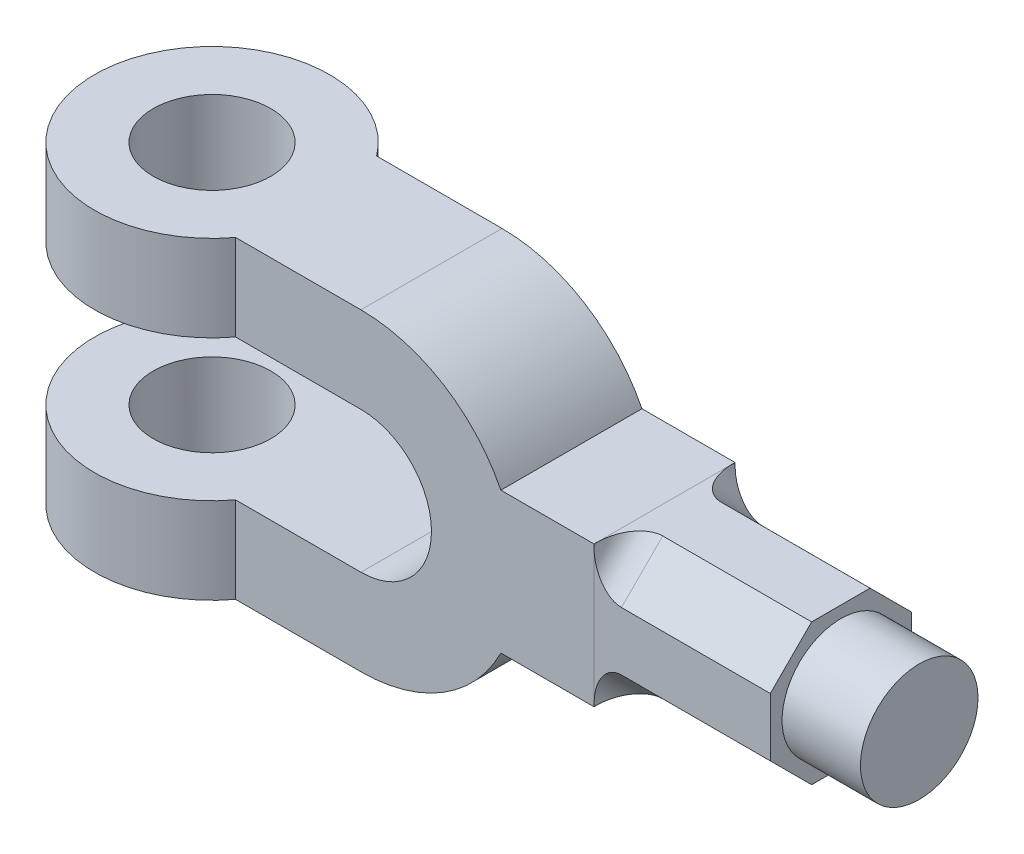
ISO-10303-21;
HEADER;
FILE_DESCRIPTION(('STEP AP214'),'2;1');
FILE_NAME('part.step','',(''),(''),'','','');
FILE_SCHEMA(('AUTOMOTIVE_DESIGN { 1 0 10303 214 1 1 1 1 }'));
ENDSEC;
DATA;
#1=APPLICATION_CONTEXT('core data for automotive mechanical design processes');
#2=APPLICATION_PROTOCOL_DEFINITION('international standard','automotive_design',2000,#1);
#3=PRODUCT_CONTEXT('',#1,'mechanical');
#4=PRODUCT('Part','Part','',(#3));
#5=PRODUCT_RELATED_PRODUCT_CATEGORY('part','',(#4));
#6=PRODUCT_DEFINITION_FORMATION('','',#4);
#7=PRODUCT_DEFINITION_CONTEXT('part definition',#1,'design');
#8=PRODUCT_DEFINITION('design','',#6,#7);
#9=PRODUCT_DEFINITION_SHAPE('','',#8);
#10=(LENGTH_UNIT() NAMED_UNIT(*) SI_UNIT(.MILLI.,.METRE.));
#11=(NAMED_UNIT(*) PLANE_ANGLE_UNIT() SI_UNIT($,.RADIAN.));
#12=(NAMED_UNIT(*) SI_UNIT($,.STERADIAN.) SOLID_ANGLE_UNIT());
#13=UNCERTAINTY_MEASURE_WITH_UNIT(LENGTH_MEASURE(1.E-05),#10,'distance_accuracy_value','');
#14=(GEOMETRIC_REPRESENTATION_CONTEXT(3) GLOBAL_UNCERTAINTY_ASSIGNED_CONTEXT((#13)) GLOBAL_UNIT_ASSIGNED_CONTEXT((#10,
#11,#12)) REPRESENTATION_CONTEXT('',''));
#15=CARTESIAN_POINT('',(0.,0.,0.));
#16=DIRECTION('',(0.,0.,1.));
#17=DIRECTION('',(1.,0.,0.));
#18=AXIS2_PLACEMENT_3D('',#15,#16,#17);
#19=CARTESIAN_POINT('',(115.485048466517,0.,18.));
#20=DIRECTION('',(1.,0.,0.));
#21=DIRECTION('',(0.,0.,-1.));
#22=AXIS2_PLACEMENT_3D('',#19,#20,#21);
#23=PLANE('',#22);
#24=CARTESIAN_POINT('',(115.485048466517,-18.,18.));
#25=DIRECTION('',(0.,0.,-1.));
#26=VECTOR('',#25,1.);
#27=LINE('',#24,#26);
#28=CARTESIAN_POINT('',(115.485048466517,-18.,18.));
#29=VERTEX_POINT('',#28);
#30=CARTESIAN_POINT('',(115.485048466517,-18.,17.3551023928193));
#31=VERTEX_POINT('',#30);
#32=EDGE_CURVE('E60',#29,#31,#27,.T.);
#33=ORIENTED_EDGE('',*,*,#32,.T.);
#34=DIRECTION('',(0.,-0.706844572080056,-0.707368893096779));
#35=VECTOR('',#34,1.);
#36=CARTESIAN_POINT('',(115.485048466517,-8.68422480163223,26.6777878185787));
#37=LINE('',#36,#35);
#38=CARTESIAN_POINT('',(115.485048466517,-17.3555804084239,18.));
#39=VERTEX_POINT('',#38);
#40=EDGE_CURVE('E662',#31,#39,#37,.F.);
#41=ORIENTED_EDGE('',*,*,#40,.T.);
#42=CARTESIAN_POINT('',(115.485048466517,-17.3555804084239,18.));
#43=DIRECTION('',(0.,-1.,0.));
#44=VECTOR('',#43,1.);
#45=LINE('',#42,#44);
#46=EDGE_CURVE('E640',#39,#29,#45,.T.);
#47=ORIENTED_EDGE('',*,*,#46,.T.);
#48=EDGE_LOOP('',(#33,#41,#47));
#49=FACE_BOUND('',#48,.T.);
#50=ADVANCED_FACE('F41',(#49),#23,.T.);
#51=CARTESIAN_POINT('',(115.485048466517,18.,18.));
#52=DIRECTION('',(0.,-1.,0.));
#53=VECTOR('',#52,1.);
#54=LINE('',#51,#53);
#55=CARTESIAN_POINT('',(115.485048466517,18.,18.));
#56=VERTEX_POINT('',#55);
#57=CARTESIAN_POINT('',(115.485048466517,17.3551023928194,18.));
#58=VERTEX_POINT('',#57);
#59=EDGE_CURVE('E320',#56,#58,#54,.T.);
#60=ORIENTED_EDGE('',*,*,#59,.T.);
#61=DIRECTION('',(0.,-0.707368893096779,0.706844572080056));
#62=VECTOR('',#61,1.);
#63=CARTESIAN_POINT('',(115.485048466517,8.67111677621415,26.6775488108421));
#64=LINE('',#63,#62);
#65=CARTESIAN_POINT('',(115.485048466517,18.,17.3555804084239));
#66=VERTEX_POINT('',#65);
#67=EDGE_CURVE('E989',#58,#66,#64,.F.);
#68=ORIENTED_EDGE('',*,*,#67,.T.);
#69=CARTESIAN_POINT('',(115.485048466517,18.,18.));
#70=DIRECTION('',(0.,0.,-1.));
#71=VECTOR('',#70,1.);
#72=LINE('',#69,#71);
#73=EDGE_CURVE('E1085',#56,#66,#72,.T.);
#74=ORIENTED_EDGE('',*,*,#73,.F.);
#75=EDGE_LOOP('',(#60,#68,#74));
#76=FACE_BOUND('',#75,.T.);
#77=ADVANCED_FACE('F795',(#76),#23,.T.);
#78=CARTESIAN_POINT('',(115.485048466517,18.,-17.3551023928194));
#79=DIRECTION('',(0.,0.,-1.));
#80=VECTOR('',#79,1.);
#81=LINE('',#78,#80);
#82=CARTESIAN_POINT('',(115.485048466517,18.,-17.3551023928194));
#83=VERTEX_POINT('',#82);
#84=CARTESIAN_POINT('',(115.485048466517,18.,-18.));
#85=VERTEX_POINT('',#84);
#86=EDGE_CURVE('E312',#83,#85,#81,.T.);
#87=ORIENTED_EDGE('',*,*,#86,.F.);
#88=DIRECTION('',(0.,0.706844572080056,0.707368893096779));
#89=VECTOR('',#88,1.);
#90=CARTESIAN_POINT('',(115.485048466517,26.6842198532067,-8.6644407854241));
#91=LINE('',#90,#89);
#92=CARTESIAN_POINT('',(115.485048466517,17.355580408424,-18.));
#93=VERTEX_POINT('',#92);
#94=EDGE_CURVE('E628',#83,#93,#91,.F.);
#95=ORIENTED_EDGE('',*,*,#94,.T.);
#96=CARTESIAN_POINT('',(115.485048466517,18.,-18.));
#97=DIRECTION('',(0.,-1.,0.));
#98=VECTOR('',#97,1.);
#99=LINE('',#96,#98);
#100=EDGE_CURVE('E360',#85,#93,#99,.T.);
#101=ORIENTED_EDGE('',*,*,#100,.F.);
#102=EDGE_LOOP('',(#87,#95,#101));
#103=FACE_BOUND('',#102,.T.);
#104=ADVANCED_FACE('F380',(#103),#23,.T.);
#105=CARTESIAN_POINT('',(0.,40.,-18.));
#106=DIRECTION('',(0.,0.,-1.));
#107=DIRECTION('',(-1.,0.,0.));
#108=AXIS2_PLACEMENT_3D('',#105,#106,#107);
#109=PLANE('',#108);
#110=DIRECTION('',(1.,0.,0.));
#111=VECTOR('',#110,1.);
#112=CARTESIAN_POINT('',(0.,18.,-18.));
#113=LINE('',#112,#111);
#114=CARTESIAN_POINT('',(24.,18.,-18.));
#115=VERTEX_POINT('',#114);
#116=CARTESIAN_POINT('',(56.,18.,-18.));
#117=VERTEX_POINT('',#116);
#118=EDGE_CURVE('E342',#115,#117,#113,.T.);
#119=ORIENTED_EDGE('',*,*,#118,.F.);
#120=DIRECTION('',(0.,-1.,0.));
#121=VECTOR('',#120,1.);
#122=CARTESIAN_POINT('',(24.,40.,-18.));
#123=LINE('',#122,#121);
#124=CARTESIAN_POINT('',(24.,40.,-18.));
#125=VERTEX_POINT('',#124);
#126=EDGE_CURVE('E336',#125,#115,#123,.T.);
#127=ORIENTED_EDGE('',*,*,#126,.F.);
#128=DIRECTION('',(1.,0.,0.));
#129=VECTOR('',#128,1.);
#130=CARTESIAN_POINT('',(0.,40.,-18.));
#131=LINE('',#130,#129);
#132=CARTESIAN_POINT('',(56.,40.,-18.));
#133=VERTEX_POINT('',#132);
#134=EDGE_CURVE('E333',#125,#133,#131,.T.);
#135=ORIENTED_EDGE('',*,*,#134,.T.);
#136=CARTESIAN_POINT('',(56.,0.,-18.));
#137=DIRECTION('',(0.,0.,-1.));
#138=DIRECTION('',(-1.,0.,0.));
#139=AXIS2_PLACEMENT_3D('',#136,#137,#138);
#140=CIRCLE('',#139,40.);
#141=CARTESIAN_POINT('',(91.7211421989835,18.,-18.));
#142=VERTEX_POINT('',#141);
#143=EDGE_CURVE('E306',#133,#142,#140,.T.);
#144=ORIENTED_EDGE('',*,*,#143,.T.);
#145=DIRECTION('',(-1.,0.,0.));
#146=VECTOR('',#145,1.);
#147=CARTESIAN_POINT('',(0.,18.,-18.));
#148=LINE('',#147,#146);
#149=EDGE_CURVE('E309',#85,#142,#148,.T.);
#150=ORIENTED_EDGE('',*,*,#149,.F.);
#151=ORIENTED_EDGE('',*,*,#100,.T.);
#152=CARTESIAN_POINT('',(115.485048466517,7.46151646033871,-17.9972348726268));
#153=DIRECTION('',(0.,0.999999931271866,0.000370750946443584));
#154=VECTOR('',#153,1.);
#155=LINE('',#152,#154);
#156=CARTESIAN_POINT('',(115.485048466517,7.46151748551237,-17.9992352682772));
#157=VERTEX_POINT('',#156);
#158=EDGE_CURVE('E451',#157,#93,#155,.T.);
#159=ORIENTED_EDGE('',*,*,#158,.F.);
#160=CARTESIAN_POINT('',(115.485048466517,-7.44917009325347,-18.0027630241587));
#161=DIRECTION('',(0.,0.999999931271866,0.000370750946443828));
#162=VECTOR('',#161,1.);
#163=LINE('',#160,#162);
#164=CARTESIAN_POINT('',(115.485048466517,-7.45017068973081,-18.0007633145425));
#165=VERTEX_POINT('',#164);
#166=EDGE_CURVE('E1016',#165,#157,#163,.T.);
#167=ORIENTED_EDGE('',*,*,#166,.F.);
#168=CARTESIAN_POINT('',(115.485048466517,-7.45017068973081,-18.));
#169=DIRECTION('',(0.,-1.,0.));
#170=VECTOR('',#169,1.);
#171=LINE('',#168,#170);
#172=CARTESIAN_POINT('',(115.485048466517,-17.3551023928194,-18.));
#173=VERTEX_POINT('',#172);
#174=EDGE_CURVE('E407',#165,#173,#171,.T.);
#175=ORIENTED_EDGE('',*,*,#174,.T.);
#176=CARTESIAN_POINT('',(115.485048466517,-17.3551023928194,-18.));
#177=DIRECTION('',(0.,-1.,0.));
#178=VECTOR('',#177,1.);
#179=LINE('',#176,#178);
#180=CARTESIAN_POINT('',(115.485048466517,-18.,-18.));
#181=VERTEX_POINT('',#180);
#182=EDGE_CURVE('E1043',#173,#181,#179,.T.);
#183=ORIENTED_EDGE('',*,*,#182,.T.);
#184=DIRECTION('',(-1.,0.,0.));
#185=VECTOR('',#184,1.);
#186=CARTESIAN_POINT('',(0.,-18.,-18.));
#187=LINE('',#186,#185);
#188=CARTESIAN_POINT('',(91.7211421989835,-18.,-18.));
#189=VERTEX_POINT('',#188);
#190=EDGE_CURVE('E288',#181,#189,#187,.T.);
#191=ORIENTED_EDGE('',*,*,#190,.T.);
#192=CARTESIAN_POINT('',(56.,0.,-18.));
#193=DIRECTION('',(0.,0.,-1.));
#194=DIRECTION('',(-1.,0.,0.));
#195=AXIS2_PLACEMENT_3D('',#192,#193,#194);
#196=CIRCLE('',#195,40.);
#197=CARTESIAN_POINT('',(56.,-40.,-18.));
#198=VERTEX_POINT('',#197);
#199=EDGE_CURVE('E300',#189,#198,#196,.T.);
#200=ORIENTED_EDGE('',*,*,#199,.T.);
#201=DIRECTION('',(1.,0.,0.));
#202=VECTOR('',#201,1.);
#203=CARTESIAN_POINT('',(0.,-40.,-18.));
#204=LINE('',#203,#202);
#205=CARTESIAN_POINT('',(24.,-40.,-18.));
#206=VERTEX_POINT('',#205);
#207=EDGE_CURVE('E276',#206,#198,#204,.T.);
#208=ORIENTED_EDGE('',*,*,#207,.F.);
#209=DIRECTION('',(0.,-1.,0.));
#210=VECTOR('',#209,1.);
#211=CARTESIAN_POINT('',(24.,40.,-18.));
#212=LINE('',#211,#210);
#213=CARTESIAN_POINT('',(24.,-18.,-18.));
#214=VERTEX_POINT('',#213);
#215=EDGE_CURVE('E286',#214,#206,#212,.T.);
#216=ORIENTED_EDGE('',*,*,#215,.F.);
#217=DIRECTION('',(-1.,0.,0.));
#218=VECTOR('',#217,1.);
#219=CARTESIAN_POINT('',(0.,-18.,-18.));
#220=LINE('',#219,#218);
#221=CARTESIAN_POINT('',(56.,-18.,-18.));
#222=VERTEX_POINT('',#221);
#223=EDGE_CURVE('E268',#222,#214,#220,.T.);
#224=ORIENTED_EDGE('',*,*,#223,.F.);
#225=CARTESIAN_POINT('',(56.,0.,-18.));
#226=DIRECTION('',(0.,0.,-1.));
#227=DIRECTION('',(-1.,0.,0.));
#228=AXIS2_PLACEMENT_3D('',#225,#226,#227);
#229=CIRCLE('',#228,18.);
#230=EDGE_CURVE('E303',#117,#222,#229,.T.);
#231=ORIENTED_EDGE('',*,*,#230,.F.);
#232=EDGE_LOOP('',(#119,#127,#135,#144,#150,#151,#159,#167,#175,#183,#191,#200,#208,#216,#224,#231));
#233=FACE_BOUND('',#232,.T.);
#234=ADVANCED_FACE('F369',(#233),#109,.T.);
#235=CARTESIAN_POINT('',(0.,40.,0.));
#236=DIRECTION('',(0.,-1.,0.));
#237=DIRECTION('',(0.,0.,-1.));
#238=AXIS2_PLACEMENT_3D('',#235,#236,#237);
#239=CYLINDRICAL_SURFACE('',#238,30.);
#240=ORIENTED_EDGE('',*,*,#126,.T.);
#241=CARTESIAN_POINT('',(0.,18.,0.));
#242=DIRECTION('',(0.,1.,0.));
#243=DIRECTION('',(0.,0.,1.));
#244=AXIS2_PLACEMENT_3D('',#241,#242,#243);
#245=CIRCLE('',#244,30.);
#246=CARTESIAN_POINT('',(24.,18.,18.));
#247=VERTEX_POINT('',#246);
#248=EDGE_CURVE('E345',#115,#247,#245,.T.);
#249=ORIENTED_EDGE('',*,*,#248,.T.);
#250=DIRECTION('',(0.,-1.,0.));
#251=VECTOR('',#250,1.);
#252=CARTESIAN_POINT('',(24.,40.,18.));
#253=LINE('',#252,#251);
#254=CARTESIAN_POINT('',(24.,40.,18.));
#255=VERTEX_POINT('',#254);
#256=EDGE_CURVE('E348',#255,#247,#253,.T.);
#257=ORIENTED_EDGE('',*,*,#256,.F.);
#258=CARTESIAN_POINT('',(0.,40.,0.));
#259=DIRECTION('',(0.,1.,0.));
#260=DIRECTION('',(0.,0.,1.));
#261=AXIS2_PLACEMENT_3D('',#258,#259,#260);
#262=CIRCLE('',#261,30.);
#263=EDGE_CURVE('E324',#125,#255,#262,.T.);
#264=ORIENTED_EDGE('',*,*,#263,.F.);
#265=EDGE_LOOP('',(#240,#249,#257,#264));
#266=FACE_BOUND('',#265,.T.);
#267=ADVANCED_FACE('F379',(#266),#239,.T.);
#268=CARTESIAN_POINT('',(0.,40.,18.));
#269=DIRECTION('',(0.,0.,-1.));
#270=DIRECTION('',(-1.,0.,0.));
#271=AXIS2_PLACEMENT_3D('',#268,#269,#270);
#272=PLANE('',#271);
#273=ORIENTED_EDGE('',*,*,#256,.T.);
#274=DIRECTION('',(1.,0.,0.));
#275=VECTOR('',#274,1.);
#276=CARTESIAN_POINT('',(0.,18.,18.));
#277=LINE('',#276,#275);
#278=CARTESIAN_POINT('',(56.,18.,18.));
#279=VERTEX_POINT('',#278);
#280=EDGE_CURVE('E339',#247,#279,#277,.T.);
#281=ORIENTED_EDGE('',*,*,#280,.T.);
#282=CARTESIAN_POINT('',(56.,0.,18.));
#283=DIRECTION('',(0.,0.,-1.));
#284=DIRECTION('',(-1.,0.,0.));
#285=AXIS2_PLACEMENT_3D('',#282,#283,#284);
#286=CIRCLE('',#285,18.);
#287=CARTESIAN_POINT('',(56.,-18.,18.));
#288=VERTEX_POINT('',#287);
#289=EDGE_CURVE('E292',#279,#288,#286,.T.);
#290=ORIENTED_EDGE('',*,*,#289,.T.);
#291=DIRECTION('',(-1.,0.,0.));
#292=VECTOR('',#291,1.);
#293=CARTESIAN_POINT('',(0.,-18.,18.));
#294=LINE('',#293,#292);
#295=CARTESIAN_POINT('',(24.,-18.,18.));
#296=VERTEX_POINT('',#295);
#297=EDGE_CURVE('E253',#288,#296,#294,.T.);
#298=ORIENTED_EDGE('',*,*,#297,.T.);
#299=DIRECTION('',(0.,-1.,0.));
#300=VECTOR('',#299,1.);
#301=CARTESIAN_POINT('',(24.,40.,18.));
#302=LINE('',#301,#300);
#303=CARTESIAN_POINT('',(24.,-40.,18.));
#304=VERTEX_POINT('',#303);
#305=EDGE_CURVE('E284',#296,#304,#302,.T.);
#306=ORIENTED_EDGE('',*,*,#305,.T.);
#307=DIRECTION('',(1.,0.,0.));
#308=VECTOR('',#307,1.);
#309=CARTESIAN_POINT('',(0.,-40.,18.));
#310=LINE('',#309,#308);
#311=CARTESIAN_POINT('',(56.,-40.,18.));
#312=VERTEX_POINT('',#311);
#313=EDGE_CURVE('E281',#304,#312,#310,.T.);
#314=ORIENTED_EDGE('',*,*,#313,.T.);
#315=CARTESIAN_POINT('',(56.,0.,18.));
#316=DIRECTION('',(0.,0.,-1.));
#317=DIRECTION('',(-1.,0.,0.));
#318=AXIS2_PLACEMENT_3D('',#315,#316,#317);
#319=CIRCLE('',#318,40.);
#320=CARTESIAN_POINT('',(91.7211421989835,-18.,18.));
#321=VERTEX_POINT('',#320);
#322=EDGE_CURVE('E289',#321,#312,#319,.T.);
#323=ORIENTED_EDGE('',*,*,#322,.F.);
#324=DIRECTION('',(-1.,0.,0.));
#325=VECTOR('',#324,1.);
#326=CARTESIAN_POINT('',(0.,-18.,18.));
#327=LINE('',#326,#325);
#328=EDGE_CURVE('E293',#29,#321,#327,.T.);
#329=ORIENTED_EDGE('',*,*,#328,.F.);
#330=ORIENTED_EDGE('',*,*,#46,.F.);
#331=CARTESIAN_POINT('',(115.485048466517,-7.4615164603387,17.9972348726268));
#332=DIRECTION('',(0.,-0.999999931271865,-0.000370750946443584));
#333=VECTOR('',#332,1.);
#334=LINE('',#331,#333);
#335=CARTESIAN_POINT('',(115.485048466517,-7.46151748551236,17.9992352682772));
#336=VERTEX_POINT('',#335);
#337=EDGE_CURVE('E11',#336,#39,#334,.T.);
#338=ORIENTED_EDGE('',*,*,#337,.F.);
#339=CARTESIAN_POINT('',(115.485048466517,7.44917009325347,18.0027630241586));
#340=DIRECTION('',(0.,-0.999999931271866,-0.000370750946443595));
#341=VECTOR('',#340,1.);
#342=LINE('',#339,#341);
#343=CARTESIAN_POINT('',(115.485048466517,7.45017068973081,18.0007633145424));
#344=VERTEX_POINT('',#343);
#345=EDGE_CURVE('E247',#344,#336,#342,.T.);
#346=ORIENTED_EDGE('',*,*,#345,.F.);
#347=CARTESIAN_POINT('',(115.485048466517,7.45017068973081,18.));
#348=DIRECTION('',(0.,1.,0.));
#349=VECTOR('',#348,1.);
#350=LINE('',#347,#349);
#351=EDGE_CURVE('E465',#344,#58,#350,.T.);
#352=ORIENTED_EDGE('',*,*,#351,.T.);
#353=ORIENTED_EDGE('',*,*,#59,.F.);
#354=DIRECTION('',(-1.,0.,0.));
#355=VECTOR('',#354,1.);
#356=CARTESIAN_POINT('',(0.,18.,18.));
#357=LINE('',#356,#355);
#358=CARTESIAN_POINT('',(91.7211421989835,18.,18.));
#359=VERTEX_POINT('',#358);
#360=EDGE_CURVE('E299',#56,#359,#357,.T.);
#361=ORIENTED_EDGE('',*,*,#360,.T.);
#362=CARTESIAN_POINT('',(56.,0.,18.));
#363=DIRECTION('',(0.,0.,-1.));
#364=DIRECTION('',(-1.,0.,0.));
#365=AXIS2_PLACEMENT_3D('',#362,#363,#364);
#366=CIRCLE('',#365,40.);
#367=CARTESIAN_POINT('',(56.,40.,18.));
#368=VERTEX_POINT('',#367);
#369=EDGE_CURVE('E296',#368,#359,#366,.T.);
#370=ORIENTED_EDGE('',*,*,#369,.F.);
#371=DIRECTION('',(1.,0.,0.));
#372=VECTOR('',#371,1.);
#373=CARTESIAN_POINT('',(0.,40.,18.));
#374=LINE('',#373,#372);
#375=EDGE_CURVE('E329',#255,#368,#374,.T.);
#376=ORIENTED_EDGE('',*,*,#375,.F.);
#377=EDGE_LOOP('',(#273,#281,#290,#298,#306,#314,#323,#329,#330,#338,#346,#352,#353,#361,#370,#376));
#378=FACE_BOUND('',#377,.T.);
#379=ADVANCED_FACE('F470',(#378),#272,.F.);
#380=CARTESIAN_POINT('',(0.,40.,0.));
#381=DIRECTION('',(0.,-1.,0.));
#382=DIRECTION('',(0.,0.,-1.));
#383=AXIS2_PLACEMENT_3D('',#380,#381,#382);
#384=CYLINDRICAL_SURFACE('',#383,15.);
#385=CARTESIAN_POINT('',(0.,18.,0.));
#386=DIRECTION('',(0.,1.,0.));
#387=DIRECTION('',(0.,0.,1.));
#388=AXIS2_PLACEMENT_3D('',#385,#386,#387);
#389=CIRCLE('',#388,15.);
#390=CARTESIAN_POINT('',(0.,18.,15.));
#391=VERTEX_POINT('',#390);
#392=EDGE_CURVE('E328',#391,#391,#389,.T.);
#393=ORIENTED_EDGE('',*,*,#392,.F.);
#394=EDGE_LOOP('',(#393));
#395=FACE_BOUND('',#394,.T.);
#396=CARTESIAN_POINT('',(0.,40.,0.));
#397=DIRECTION('',(0.,1.,0.));
#398=DIRECTION('',(0.,0.,1.));
#399=AXIS2_PLACEMENT_3D('',#396,#397,#398);
#400=CIRCLE('',#399,15.);
#401=CARTESIAN_POINT('',(0.,40.,15.));
#402=VERTEX_POINT('',#401);
#403=EDGE_CURVE('E325',#402,#402,#400,.T.);
#404=ORIENTED_EDGE('',*,*,#403,.T.);
#405=EDGE_LOOP('',(#404));
#406=FACE_BOUND('',#405,.T.);
#407=ADVANCED_FACE('F479',(#395,#406),#384,.F.);
#408=CARTESIAN_POINT('',(0.,40.,0.));
#409=DIRECTION('',(0.,1.,0.));
#410=DIRECTION('',(0.,0.,1.));
#411=AXIS2_PLACEMENT_3D('',#408,#409,#410);
#412=PLANE('',#411);
#413=ORIENTED_EDGE('',*,*,#403,.F.);
#414=EDGE_LOOP('',(#413));
#415=FACE_BOUND('',#414,.T.);
#416=ORIENTED_EDGE('',*,*,#134,.F.);
#417=ORIENTED_EDGE('',*,*,#263,.T.);
#418=ORIENTED_EDGE('',*,*,#375,.T.);
#419=DIRECTION('',(0.,0.,-1.));
#420=VECTOR('',#419,1.);
#421=CARTESIAN_POINT('',(56.,40.,0.));
#422=LINE('',#421,#420);
#423=EDGE_CURVE('E326',#368,#133,#422,.T.);
#424=ORIENTED_EDGE('',*,*,#423,.T.);
#425=EDGE_LOOP('',(#416,#417,#418,#424));
#426=FACE_BOUND('',#425,.T.);
#427=ADVANCED_FACE('F533',(#415,#426),#412,.T.);
#428=CARTESIAN_POINT('',(-36.8492759980629,18.,-40.));
#429=DIRECTION('',(0.,1.,0.));
#430=DIRECTION('',(0.,0.,1.));
#431=AXIS2_PLACEMENT_3D('',#428,#429,#430);
#432=PLANE('',#431);
#433=ORIENTED_EDGE('',*,*,#392,.T.);
#434=EDGE_LOOP('',(#433));
#435=FACE_BOUND('',#434,.T.);
#436=ORIENTED_EDGE('',*,*,#118,.T.);
#437=DIRECTION('',(0.,0.,-1.));
#438=VECTOR('',#437,1.);
#439=CARTESIAN_POINT('',(56.,18.,0.));
#440=LINE('',#439,#438);
#441=EDGE_CURVE('E321',#279,#117,#440,.T.);
#442=ORIENTED_EDGE('',*,*,#441,.F.);
#443=ORIENTED_EDGE('',*,*,#280,.F.);
#444=ORIENTED_EDGE('',*,*,#248,.F.);
#445=EDGE_LOOP('',(#436,#442,#443,#444));
#446=FACE_BOUND('',#445,.T.);
#447=ADVANCED_FACE('F530',(#435,#446),#432,.F.);
#448=CARTESIAN_POINT('',(0.,-18.,18.));
#449=DIRECTION('',(0.,-1.,0.));
#450=DIRECTION('',(1.,0.,0.));
#451=AXIS2_PLACEMENT_3D('',#448,#449,#450);
#452=PLANE('',#451);
#453=ORIENTED_EDGE('',*,*,#190,.F.);
#454=CARTESIAN_POINT('',(115.485048466517,-18.,-17.355580408424));
#455=DIRECTION('',(0.,0.,-1.));
#456=VECTOR('',#455,1.);
#457=LINE('',#454,#456);
#458=CARTESIAN_POINT('',(115.485048466517,-18.,-17.355580408424));
#459=VERTEX_POINT('',#458);
#460=EDGE_CURVE('E1062',#459,#181,#457,.T.);
#461=ORIENTED_EDGE('',*,*,#460,.F.);
#462=CARTESIAN_POINT('',(115.485048466517,-17.9972348726268,-7.46151646033873));
#463=DIRECTION('',(0.,0.000370750946443934,-0.999999931271866));
#464=VECTOR('',#463,1.);
#465=LINE('',#462,#464);
#466=CARTESIAN_POINT('',(115.485048466517,-17.9992352682772,-7.46151748551239));
#467=VERTEX_POINT('',#466);
#468=EDGE_CURVE('E696',#467,#459,#465,.T.);
#469=ORIENTED_EDGE('',*,*,#468,.F.);
#470=CARTESIAN_POINT('',(115.485048466517,-18.0027630241586,7.44917009325343));
#471=DIRECTION('',(0.,0.00037075094644406,-0.999999931271866));
#472=VECTOR('',#471,1.);
#473=LINE('',#470,#472);
#474=CARTESIAN_POINT('',(115.485048466517,-18.0007633145424,7.45017068973077));
#475=VERTEX_POINT('',#474);
#476=EDGE_CURVE('E510',#475,#467,#473,.T.);
#477=ORIENTED_EDGE('',*,*,#476,.F.);
#478=CARTESIAN_POINT('',(115.485048466517,-18.,7.45017068973077));
#479=DIRECTION('',(0.,0.,1.));
#480=VECTOR('',#479,1.);
#481=LINE('',#478,#480);
#482=EDGE_CURVE('E53',#475,#31,#481,.T.);
#483=ORIENTED_EDGE('',*,*,#482,.T.);
#484=ORIENTED_EDGE('',*,*,#32,.F.);
#485=ORIENTED_EDGE('',*,*,#328,.T.);
#486=DIRECTION('',(0.,0.,-1.));
#487=VECTOR('',#486,1.);
#488=CARTESIAN_POINT('',(91.7211421989835,-18.,18.));
#489=LINE('',#488,#487);
#490=EDGE_CURVE('E318',#321,#189,#489,.T.);
#491=ORIENTED_EDGE('',*,*,#490,.T.);
#492=EDGE_LOOP('',(#453,#461,#469,#477,#483,#484,#485,#491));
#493=FACE_BOUND('',#492,.T.);
#494=ADVANCED_FACE('F519',(#493),#452,.T.);
#495=ORIENTED_EDGE('',*,*,#182,.F.);
#496=DIRECTION('',(0.,0.707368893096779,-0.706844572080056));
#497=VECTOR('',#496,1.);
#498=CARTESIAN_POINT('',(115.485048466517,-26.6711118277886,-8.69089584399683));
#499=LINE('',#498,#497);
#500=EDGE_CURVE('E1036',#173,#459,#499,.F.);
#501=ORIENTED_EDGE('',*,*,#500,.T.);
#502=ORIENTED_EDGE('',*,*,#460,.T.);
#503=EDGE_LOOP('',(#495,#501,#502));
#504=FACE_BOUND('',#503,.T.);
#505=ADVANCED_FACE('F529',(#504),#23,.T.);
#506=CARTESIAN_POINT('',(0.,18.,18.));
#507=DIRECTION('',(0.,-1.,0.));
#508=DIRECTION('',(0.,0.,-1.));
#509=AXIS2_PLACEMENT_3D('',#506,#507,#508);
#510=PLANE('',#509);
#511=ORIENTED_EDGE('',*,*,#149,.T.);
#512=DIRECTION('',(0.,0.,-1.));
#513=VECTOR('',#512,1.);
#514=CARTESIAN_POINT('',(91.7211421989835,18.,18.));
#515=LINE('',#514,#513);
#516=EDGE_CURVE('E310',#359,#142,#515,.T.);
#517=ORIENTED_EDGE('',*,*,#516,.F.);
#518=ORIENTED_EDGE('',*,*,#360,.F.);
#519=ORIENTED_EDGE('',*,*,#73,.T.);
#520=CARTESIAN_POINT('',(115.485048466517,17.9972348726268,7.46151646033867));
#521=DIRECTION('',(0.,-0.000370750946443584,0.999999931271866));
#522=VECTOR('',#521,1.);
#523=LINE('',#520,#522);
#524=CARTESIAN_POINT('',(115.485048466517,17.9992352682772,7.46151748551233));
#525=VERTEX_POINT('',#524);
#526=EDGE_CURVE('E586',#525,#66,#523,.T.);
#527=ORIENTED_EDGE('',*,*,#526,.F.);
#528=CARTESIAN_POINT('',(115.485048466517,18.0027630241586,-7.4491700932535));
#529=DIRECTION('',(0.,-0.000370750946443828,0.999999931271866));
#530=VECTOR('',#529,1.);
#531=LINE('',#528,#530);
#532=CARTESIAN_POINT('',(115.485048466517,18.0007633145424,-7.45017068973085));
#533=VERTEX_POINT('',#532);
#534=EDGE_CURVE('E1015',#533,#525,#531,.T.);
#535=ORIENTED_EDGE('',*,*,#534,.F.);
#536=CARTESIAN_POINT('',(115.485048466517,18.,-7.45017068973085));
#537=DIRECTION('',(0.,0.,-1.));
#538=VECTOR('',#537,1.);
#539=LINE('',#536,#538);
#540=EDGE_CURVE('E549',#533,#83,#539,.T.);
#541=ORIENTED_EDGE('',*,*,#540,.T.);
#542=ORIENTED_EDGE('',*,*,#86,.T.);
#543=EDGE_LOOP('',(#511,#517,#518,#519,#527,#535,#541,#542));
#544=FACE_BOUND('',#543,.T.);
#545=ADVANCED_FACE('F591',(#544),#510,.F.);
#546=CARTESIAN_POINT('',(56.,0.,18.));
#547=DIRECTION('',(0.,0.,-1.));
#548=DIRECTION('',(-1.,0.,0.));
#549=AXIS2_PLACEMENT_3D('',#546,#547,#548);
#550=CYLINDRICAL_SURFACE('',#549,40.);
#551=ORIENTED_EDGE('',*,*,#143,.F.);
#552=ORIENTED_EDGE('',*,*,#423,.F.);
#553=ORIENTED_EDGE('',*,*,#369,.T.);
#554=ORIENTED_EDGE('',*,*,#516,.T.);
#555=EDGE_LOOP('',(#551,#552,#553,#554));
#556=FACE_BOUND('',#555,.T.);
#557=ADVANCED_FACE('F601',(#556),#550,.T.);
#558=CARTESIAN_POINT('',(56.,0.,18.));
#559=DIRECTION('',(0.,0.,-1.));
#560=DIRECTION('',(-1.,0.,0.));
#561=AXIS2_PLACEMENT_3D('',#558,#559,#560);
#562=CYLINDRICAL_SURFACE('',#561,18.);
#563=ORIENTED_EDGE('',*,*,#230,.T.);
#564=DIRECTION('',(0.,0.,-1.));
#565=VECTOR('',#564,1.);
#566=CARTESIAN_POINT('',(56.,-18.,18.));
#567=LINE('',#566,#565);
#568=EDGE_CURVE('E313',#288,#222,#567,.T.);
#569=ORIENTED_EDGE('',*,*,#568,.F.);
#570=ORIENTED_EDGE('',*,*,#289,.F.);
#571=ORIENTED_EDGE('',*,*,#441,.T.);
#572=EDGE_LOOP('',(#563,#569,#570,#571));
#573=FACE_BOUND('',#572,.T.);
#574=ADVANCED_FACE('F790',(#573),#562,.F.);
#575=CARTESIAN_POINT('',(56.,0.,18.));
#576=DIRECTION('',(0.,0.,-1.));
#577=DIRECTION('',(-1.,0.,0.));
#578=AXIS2_PLACEMENT_3D('',#575,#576,#577);
#579=CYLINDRICAL_SURFACE('',#578,40.);
#580=ORIENTED_EDGE('',*,*,#199,.F.);
#581=ORIENTED_EDGE('',*,*,#490,.F.);
#582=ORIENTED_EDGE('',*,*,#322,.T.);
#583=DIRECTION('',(0.,0.,-1.));
#584=VECTOR('',#583,1.);
#585=CARTESIAN_POINT('',(56.,-40.,18.));
#586=LINE('',#585,#584);
#587=EDGE_CURVE('E315',#312,#198,#586,.T.);
#588=ORIENTED_EDGE('',*,*,#587,.T.);
#589=EDGE_LOOP('',(#580,#581,#582,#588));
#590=FACE_BOUND('',#589,.T.);
#591=ADVANCED_FACE('F531',(#590),#579,.T.);
#592=CARTESIAN_POINT('',(0.,40.,0.));
#593=DIRECTION('',(0.,-1.,0.));
#594=DIRECTION('',(0.,0.,-1.));
#595=AXIS2_PLACEMENT_3D('',#592,#593,#594);
#596=CYLINDRICAL_SURFACE('',#595,15.);
#597=CARTESIAN_POINT('',(0.,-18.,0.));
#598=DIRECTION('',(0.,-1.,0.));
#599=DIRECTION('',(0.,0.,-1.));
#600=AXIS2_PLACEMENT_3D('',#597,#598,#599);
#601=CIRCLE('',#600,15.);
#602=CARTESIAN_POINT('',(0.,-18.,-15.));
#603=VERTEX_POINT('',#602);
#604=EDGE_CURVE('E270',#603,#603,#601,.T.);
#605=ORIENTED_EDGE('',*,*,#604,.F.);
#606=EDGE_LOOP('',(#605));
#607=FACE_BOUND('',#606,.T.);
#608=CARTESIAN_POINT('',(0.,-40.,0.));
#609=DIRECTION('',(0.,1.,0.));
#610=DIRECTION('',(0.,0.,1.));
#611=AXIS2_PLACEMENT_3D('',#608,#609,#610);
#612=CIRCLE('',#611,15.);
#613=CARTESIAN_POINT('',(0.,-40.,15.));
#614=VERTEX_POINT('',#613);
#615=EDGE_CURVE('E273',#614,#614,#612,.T.);
#616=ORIENTED_EDGE('',*,*,#615,.F.);
#617=EDGE_LOOP('',(#616));
#618=FACE_BOUND('',#617,.T.);
#619=ADVANCED_FACE('F781',(#607,#618),#596,.F.);
#620=CARTESIAN_POINT('',(0.,-40.,0.));
#621=DIRECTION('',(0.,1.,0.));
#622=DIRECTION('',(0.,0.,1.));
#623=AXIS2_PLACEMENT_3D('',#620,#621,#622);
#624=PLANE('',#623);
#625=ORIENTED_EDGE('',*,*,#615,.T.);
#626=EDGE_LOOP('',(#625));
#627=FACE_BOUND('',#626,.T.);
#628=ORIENTED_EDGE('',*,*,#207,.T.);
#629=ORIENTED_EDGE('',*,*,#587,.F.);
#630=ORIENTED_EDGE('',*,*,#313,.F.);
#631=CARTESIAN_POINT('',(0.,-40.,0.));
#632=DIRECTION('',(0.,1.,0.));
#633=DIRECTION('',(0.,0.,1.));
#634=AXIS2_PLACEMENT_3D('',#631,#632,#633);
#635=CIRCLE('',#634,30.);
#636=EDGE_CURVE('E278',#206,#304,#635,.T.);
#637=ORIENTED_EDGE('',*,*,#636,.F.);
#638=EDGE_LOOP('',(#628,#629,#630,#637));
#639=FACE_BOUND('',#638,.T.);
#640=ADVANCED_FACE('F778',(#627,#639),#624,.F.);
#641=CARTESIAN_POINT('',(0.,40.,0.));
#642=DIRECTION('',(0.,-1.,0.));
#643=DIRECTION('',(0.,0.,-1.));
#644=AXIS2_PLACEMENT_3D('',#641,#642,#643);
#645=CYLINDRICAL_SURFACE('',#644,30.);
#646=ORIENTED_EDGE('',*,*,#305,.F.);
#647=CARTESIAN_POINT('',(0.,-18.,0.));
#648=DIRECTION('',(0.,-1.,0.));
#649=DIRECTION('',(0.,0.,-1.));
#650=AXIS2_PLACEMENT_3D('',#647,#648,#649);
#651=CIRCLE('',#650,30.);
#652=EDGE_CURVE('E256',#296,#214,#651,.T.);
#653=ORIENTED_EDGE('',*,*,#652,.T.);
#654=ORIENTED_EDGE('',*,*,#215,.T.);
#655=ORIENTED_EDGE('',*,*,#636,.T.);
#656=EDGE_LOOP('',(#646,#653,#654,#655));
#657=FACE_BOUND('',#656,.T.);
#658=ADVANCED_FACE('F776',(#657),#645,.T.);
#659=CARTESIAN_POINT('',(-36.8492759980629,-18.,-40.));
#660=DIRECTION('',(0.,-1.,0.));
#661=DIRECTION('',(0.,0.,-1.));
#662=AXIS2_PLACEMENT_3D('',#659,#660,#661);
#663=PLANE('',#662);
#664=ORIENTED_EDGE('',*,*,#604,.T.);
#665=EDGE_LOOP('',(#664));
#666=FACE_BOUND('',#665,.T.);
#667=ORIENTED_EDGE('',*,*,#223,.T.);
#668=ORIENTED_EDGE('',*,*,#652,.F.);
#669=ORIENTED_EDGE('',*,*,#297,.F.);
#670=ORIENTED_EDGE('',*,*,#568,.T.);
#671=EDGE_LOOP('',(#667,#668,#669,#670));
#672=FACE_BOUND('',#671,.T.);
#673=ADVANCED_FACE('F764',(#666,#672),#663,.F.);
#674=CARTESIAN_POINT('',(160.485048466517,-18.0027630241586,7.44917009325341));
#675=DIRECTION('',(0.,0.999999931271865,0.00037075094644406));
#676=DIRECTION('',(0.,-0.00037075094644406,0.999999931271865));
#677=AXIS2_PLACEMENT_3D('',#674,#675,#676);
#678=PLANE('',#677);
#679=ORIENTED_EDGE('',*,*,#476,.T.);
#680=ORIENTED_EDGE('',*,*,#468,.T.);
#681=CARTESIAN_POINT('',(122.485048466517,-17.9935642545115,-17.3620113835633));
#682=DIRECTION('',(0.,0.999999931271865,0.00037075094644406));
#683=DIRECTION('',(0.,0.00037075094644406,-0.999999931271865));
#684=AXIS2_PLACEMENT_3D('',#681,#682,#683);
#685=ELLIPSE('',#684,9.89949493661167,7.);
#686=CARTESIAN_POINT('',(122.485048466517,-17.9972345016285,-7.46251712732548));
#687=VERTEX_POINT('',#686);
#688=EDGE_CURVE('E252',#459,#687,#685,.T.);
#689=ORIENTED_EDGE('',*,*,#688,.T.);
#690=DIRECTION('',(-1.,0.,0.));
#691=VECTOR('',#690,1.);
#692=CARTESIAN_POINT('',(160.485048466517,-17.9972345016285,-7.46251712732549));
#693=LINE('',#692,#691);
#694=CARTESIAN_POINT('',(160.485048466517,-17.9972345016285,-7.46251712732549));
#695=VERTEX_POINT('',#694);
#696=EDGE_CURVE('E231',#695,#687,#693,.T.);
#697=ORIENTED_EDGE('',*,*,#696,.F.);
#698=DIRECTION('',(0.,0.00037075094644406,-0.999999931271866));
#699=VECTOR('',#698,1.);
#700=CARTESIAN_POINT('',(160.485048466517,-18.0027630241586,7.44917009325341));
#701=LINE('',#700,#699);
#702=CARTESIAN_POINT('',(160.485048466517,-18.0027630241586,7.44917009325341));
#703=VERTEX_POINT('',#702);
#704=EDGE_CURVE('E238',#703,#695,#701,.T.);
#705=ORIENTED_EDGE('',*,*,#704,.F.);
#706=DIRECTION('',(-1.,0.,0.));
#707=VECTOR('',#706,1.);
#708=CARTESIAN_POINT('',(160.485048466517,-18.0027630241586,7.44917009325341));
#709=LINE('',#708,#707);
#710=CARTESIAN_POINT('',(122.485048466517,-18.0027630241586,7.44917009325342));
#711=VERTEX_POINT('',#710);
#712=EDGE_CURVE('E750',#703,#711,#709,.T.);
#713=ORIENTED_EDGE('',*,*,#712,.T.);
#714=CARTESIAN_POINT('',(122.485048466517,-18.0064332712757,17.3486643494913));
#715=DIRECTION('',(0.,0.999999931271865,0.00037075094644406));
#716=DIRECTION('',(0.,0.00037075094644406,-0.999999931271865));
#717=AXIS2_PLACEMENT_3D('',#714,#715,#716);
#718=ELLIPSE('',#717,9.89949493661166,7.);
#719=EDGE_CURVE('E687',#711,#31,#718,.T.);
#720=ORIENTED_EDGE('',*,*,#719,.T.);
#721=ORIENTED_EDGE('',*,*,#482,.F.);
#722=EDGE_LOOP('',(#679,#680,#689,#697,#705,#713,#720,#721));
#723=FACE_BOUND('',#722,.T.);
#724=ADVANCED_FACE('F250',(#723),#678,.F.);
#725=CARTESIAN_POINT('',(160.485048466517,-17.9972345016285,-7.46251712732549));
#726=DIRECTION('',(0.,0.706844572080056,0.707368893096779));
#727=DIRECTION('',(0.,-0.707368893096779,0.706844572080056));
#728=AXIS2_PLACEMENT_3D('',#725,#726,#727);
#729=PLANE('',#728);
#730=ORIENTED_EDGE('',*,*,#696,.T.);
#731=DIRECTION('',(0.,0.707368893096779,-0.706844572080056));
#732=VECTOR('',#731,1.);
#733=CARTESIAN_POINT('',(122.485048466517,-17.9972345016285,-7.46251712732548));
#734=LINE('',#733,#732);
#735=CARTESIAN_POINT('',(122.485048466517,-7.44917009325347,-18.0027630241587));
#736=VERTEX_POINT('',#735);
#737=EDGE_CURVE('E511',#687,#736,#734,.T.);
#738=ORIENTED_EDGE('',*,*,#737,.T.);
#739=DIRECTION('',(-1.,0.,0.));
#740=VECTOR('',#739,1.);
#741=CARTESIAN_POINT('',(160.485048466517,-7.44917009325347,-18.0027630241587));
#742=LINE('',#741,#740);
#743=CARTESIAN_POINT('',(160.485048466517,-7.44917009325347,-18.0027630241587));
#744=VERTEX_POINT('',#743);
#745=EDGE_CURVE('E234',#744,#736,#742,.T.);
#746=ORIENTED_EDGE('',*,*,#745,.F.);
#747=DIRECTION('',(0.,0.707368893096779,-0.706844572080056));
#748=VECTOR('',#747,1.);
#749=CARTESIAN_POINT('',(160.485048466517,-17.9972345016285,-7.46251712732549));
#750=LINE('',#749,#748);
#751=EDGE_CURVE('E226',#695,#744,#750,.T.);
#752=ORIENTED_EDGE('',*,*,#751,.F.);
#753=EDGE_LOOP('',(#730,#738,#746,#752));
#754=FACE_BOUND('',#753,.T.);
#755=ADVANCED_FACE('F228',(#754),#729,.F.);
#756=CARTESIAN_POINT('',(160.485048466517,-7.44917009325347,-18.0027630241587));
#757=DIRECTION('',(0.,-0.000370750946443828,0.999999931271865));
#758=DIRECTION('',(0.,-0.999999931271865,-0.000370750946443828));
#759=AXIS2_PLACEMENT_3D('',#756,#757,#758);
#760=PLANE('',#759);
#761=ORIENTED_EDGE('',*,*,#166,.T.);
#762=ORIENTED_EDGE('',*,*,#158,.T.);
#763=CARTESIAN_POINT('',(122.485048466517,17.3620113835633,-17.9935642545115));
#764=DIRECTION('',(0.,-0.000370750946443828,0.999999931271865));
#765=DIRECTION('',(0.,0.999999931271865,0.000370750946443828));
#766=AXIS2_PLACEMENT_3D('',#763,#764,#765);
#767=ELLIPSE('',#766,9.89949493661167,7.);
#768=CARTESIAN_POINT('',(122.485048466517,7.46251712732543,-17.9972345016286));
#769=VERTEX_POINT('',#768);
#770=EDGE_CURVE('E675',#93,#769,#767,.T.);
#771=ORIENTED_EDGE('',*,*,#770,.T.);
#772=DIRECTION('',(-1.,0.,0.));
#773=VECTOR('',#772,1.);
#774=CARTESIAN_POINT('',(160.485048466517,7.46251712732543,-17.9972345016286));
#775=LINE('',#774,#773);
#776=CARTESIAN_POINT('',(160.485048466517,7.46251712732543,-17.9972345016286));
#777=VERTEX_POINT('',#776);
#778=EDGE_CURVE('E258',#777,#769,#775,.T.);
#779=ORIENTED_EDGE('',*,*,#778,.F.);
#780=DIRECTION('',(0.,0.999999931271866,0.000370750946443828));
#781=VECTOR('',#780,1.);
#782=CARTESIAN_POINT('',(160.485048466517,-7.44917009325347,-18.0027630241587));
#783=LINE('',#782,#781);
#784=EDGE_CURVE('E237',#744,#777,#783,.T.);
#785=ORIENTED_EDGE('',*,*,#784,.F.);
#786=ORIENTED_EDGE('',*,*,#745,.T.);
#787=CARTESIAN_POINT('',(122.485048466517,-17.3486643494913,-18.0064332712757));
#788=DIRECTION('',(0.,-0.000370750946443828,0.999999931271865));
#789=DIRECTION('',(0.,0.999999931271865,0.000370750946443828));
#790=AXIS2_PLACEMENT_3D('',#787,#788,#789);
#791=ELLIPSE('',#790,9.89949493661166,7.);
#792=EDGE_CURVE('E664',#736,#173,#791,.T.);
#793=ORIENTED_EDGE('',*,*,#792,.T.);
#794=ORIENTED_EDGE('',*,*,#174,.F.);
#795=EDGE_LOOP('',(#761,#762,#771,#779,#785,#786,#793,#794));
#796=FACE_BOUND('',#795,.T.);
#797=ADVANCED_FACE('F421',(#796),#760,.F.);
#798=CARTESIAN_POINT('',(160.485048466517,7.46251712732543,-17.9972345016286));
#799=DIRECTION('',(0.,-0.707368893096779,0.706844572080056));
#800=DIRECTION('',(0.,-0.706844572080056,-0.707368893096779));
#801=AXIS2_PLACEMENT_3D('',#798,#799,#800);
#802=PLANE('',#801);
#803=ORIENTED_EDGE('',*,*,#778,.T.);
#804=DIRECTION('',(0.,0.706844572080056,0.707368893096779));
#805=VECTOR('',#804,1.);
#806=CARTESIAN_POINT('',(122.485048466517,7.46251712732543,-17.9972345016286));
#807=LINE('',#806,#805);
#808=CARTESIAN_POINT('',(122.485048466517,18.0027630241586,-7.4491700932535));
#809=VERTEX_POINT('',#808);
#810=EDGE_CURVE('E623',#769,#809,#807,.T.);
#811=ORIENTED_EDGE('',*,*,#810,.T.);
#812=DIRECTION('',(-1.,0.,0.));
#813=VECTOR('',#812,1.);
#814=CARTESIAN_POINT('',(160.485048466517,18.0027630241586,-7.44917009325351));
#815=LINE('',#814,#813);
#816=CARTESIAN_POINT('',(160.485048466517,18.0027630241586,-7.44917009325351));
#817=VERTEX_POINT('',#816);
#818=EDGE_CURVE('E998',#817,#809,#815,.T.);
#819=ORIENTED_EDGE('',*,*,#818,.F.);
#820=DIRECTION('',(0.,0.706844572080056,0.707368893096779));
#821=VECTOR('',#820,1.);
#822=CARTESIAN_POINT('',(160.485048466517,7.46251712732543,-17.9972345016286));
#823=LINE('',#822,#821);
#824=EDGE_CURVE('E1025',#777,#817,#823,.T.);
#825=ORIENTED_EDGE('',*,*,#824,.F.);
#826=EDGE_LOOP('',(#803,#811,#819,#825));
#827=FACE_BOUND('',#826,.T.);
#828=ADVANCED_FACE('F431',(#827),#802,.F.);
#829=CARTESIAN_POINT('',(160.485048466517,18.0027630241586,-7.44917009325351));
#830=DIRECTION('',(0.,-0.999999931271865,-0.000370750946443828));
#831=DIRECTION('',(0.,0.000370750946443828,-0.999999931271865));
#832=AXIS2_PLACEMENT_3D('',#829,#830,#831);
#833=PLANE('',#832);
#834=ORIENTED_EDGE('',*,*,#534,.T.);
#835=ORIENTED_EDGE('',*,*,#526,.T.);
#836=CARTESIAN_POINT('',(122.485048466517,17.9935642545115,17.3620113835633));
#837=DIRECTION('',(0.,-0.999999931271865,-0.000370750946443828));
#838=DIRECTION('',(0.,-0.000370750946443828,0.999999931271865));
#839=AXIS2_PLACEMENT_3D('',#836,#837,#838);
#840=ELLIPSE('',#839,9.89949493661167,7.);
#841=CARTESIAN_POINT('',(122.485048466517,17.9972345016285,7.4625171273254));
#842=VERTEX_POINT('',#841);
#843=EDGE_CURVE('E683',#66,#842,#840,.T.);
#844=ORIENTED_EDGE('',*,*,#843,.T.);
#845=DIRECTION('',(-1.,0.,0.));
#846=VECTOR('',#845,1.);
#847=CARTESIAN_POINT('',(160.485048466517,17.9972345016285,7.46251712732539));
#848=LINE('',#847,#846);
#849=CARTESIAN_POINT('',(160.485048466517,17.9972345016285,7.46251712732539));
#850=VERTEX_POINT('',#849);
#851=EDGE_CURVE('E745',#850,#842,#848,.T.);
#852=ORIENTED_EDGE('',*,*,#851,.F.);
#853=DIRECTION('',(0.,-0.000370750946443828,0.999999931271866));
#854=VECTOR('',#853,1.);
#855=CARTESIAN_POINT('',(160.485048466517,18.0027630241586,-7.44917009325351));
#856=LINE('',#855,#854);
#857=EDGE_CURVE('E1027',#817,#850,#856,.T.);
#858=ORIENTED_EDGE('',*,*,#857,.F.);
#859=ORIENTED_EDGE('',*,*,#818,.T.);
#860=CARTESIAN_POINT('',(122.485048466517,18.0064332712757,-17.3486643494913));
#861=DIRECTION('',(0.,-0.999999931271865,-0.000370750946443828));
#862=DIRECTION('',(0.,-0.000370750946443828,0.999999931271865));
#863=AXIS2_PLACEMENT_3D('',#860,#861,#862);
#864=ELLIPSE('',#863,9.89949493661166,7.);
#865=EDGE_CURVE('E671',#809,#83,#864,.T.);
#866=ORIENTED_EDGE('',*,*,#865,.T.);
#867=ORIENTED_EDGE('',*,*,#540,.F.);
#868=EDGE_LOOP('',(#834,#835,#844,#852,#858,#859,#866,#867));
#869=FACE_BOUND('',#868,.T.);
#870=ADVANCED_FACE('F556',(#869),#833,.F.);
#871=CARTESIAN_POINT('',(160.485048466517,17.9972345016285,7.46251712732539));
#872=DIRECTION('',(0.,-0.706844572080056,-0.707368893096779));
#873=DIRECTION('',(0.,0.707368893096779,-0.706844572080056));
#874=AXIS2_PLACEMENT_3D('',#871,#872,#873);
#875=PLANE('',#874);
#876=ORIENTED_EDGE('',*,*,#851,.T.);
#877=DIRECTION('',(0.,-0.707368893096779,0.706844572080056));
#878=VECTOR('',#877,1.);
#879=CARTESIAN_POINT('',(122.485048466517,17.9972345016285,7.4625171273254));
#880=LINE('',#879,#878);
#881=CARTESIAN_POINT('',(122.485048466517,7.44917009325347,18.0027630241586));
#882=VERTEX_POINT('',#881);
#883=EDGE_CURVE('E991',#842,#882,#880,.T.);
#884=ORIENTED_EDGE('',*,*,#883,.T.);
#885=DIRECTION('',(-1.,0.,0.));
#886=VECTOR('',#885,1.);
#887=CARTESIAN_POINT('',(160.485048466517,7.44917009325347,18.0027630241586));
#888=LINE('',#887,#886);
#889=CARTESIAN_POINT('',(160.485048466517,7.44917009325347,18.0027630241586));
#890=VERTEX_POINT('',#889);
#891=EDGE_CURVE('E737',#890,#882,#888,.T.);
#892=ORIENTED_EDGE('',*,*,#891,.F.);
#893=DIRECTION('',(0.,-0.707368893096779,0.706844572080056));
#894=VECTOR('',#893,1.);
#895=CARTESIAN_POINT('',(160.485048466517,17.9972345016285,7.46251712732539));
#896=LINE('',#895,#894);
#897=EDGE_CURVE('E997',#850,#890,#896,.T.);
#898=ORIENTED_EDGE('',*,*,#897,.F.);
#899=EDGE_LOOP('',(#876,#884,#892,#898));
#900=FACE_BOUND('',#899,.T.);
#901=ADVANCED_FACE('F565',(#900),#875,.F.);
#902=CARTESIAN_POINT('',(160.485048466517,7.44917009325347,18.0027630241586));
#903=DIRECTION('',(0.,0.000370750946443595,-0.999999931271865));
#904=DIRECTION('',(0.,0.999999931271865,0.000370750946443595));
#905=AXIS2_PLACEMENT_3D('',#902,#903,#904);
#906=PLANE('',#905);
#907=ORIENTED_EDGE('',*,*,#345,.T.);
#908=ORIENTED_EDGE('',*,*,#337,.T.);
#909=CARTESIAN_POINT('',(122.485048466517,-17.3620113835633,17.9935642545114));
#910=DIRECTION('',(0.,0.000370750946443595,-0.999999931271865));
#911=DIRECTION('',(0.,-0.999999931271865,-0.000370750946443595));
#912=AXIS2_PLACEMENT_3D('',#909,#910,#911);
#913=ELLIPSE('',#912,9.89949493661167,7.);
#914=CARTESIAN_POINT('',(122.485048466517,-7.46251712732544,17.9972345016285));
#915=VERTEX_POINT('',#914);
#916=EDGE_CURVE('E691',#39,#915,#913,.T.);
#917=ORIENTED_EDGE('',*,*,#916,.T.);
#918=DIRECTION('',(-1.,0.,0.));
#919=VECTOR('',#918,1.);
#920=CARTESIAN_POINT('',(160.485048466517,-7.46251712732544,17.9972345016285));
#921=LINE('',#920,#919);
#922=CARTESIAN_POINT('',(160.485048466517,-7.46251712732544,17.9972345016285));
#923=VERTEX_POINT('',#922);
#924=EDGE_CURVE('E746',#923,#915,#921,.T.);
#925=ORIENTED_EDGE('',*,*,#924,.F.);
#926=DIRECTION('',(0.,-0.999999931271866,-0.000370750946443595));
#927=VECTOR('',#926,1.);
#928=CARTESIAN_POINT('',(160.485048466517,7.44917009325347,18.0027630241586));
#929=LINE('',#928,#927);
#930=EDGE_CURVE('E1030',#890,#923,#929,.T.);
#931=ORIENTED_EDGE('',*,*,#930,.F.);
#932=ORIENTED_EDGE('',*,*,#891,.T.);
#933=CARTESIAN_POINT('',(122.485048466517,17.3486643494913,18.0064332712756));
#934=DIRECTION('',(0.,0.000370750946443595,-0.999999931271865));
#935=DIRECTION('',(0.,-0.999999931271865,-0.000370750946443595));
#936=AXIS2_PLACEMENT_3D('',#933,#934,#935);
#937=ELLIPSE('',#936,9.89949493661167,7.);
#938=EDGE_CURVE('E679',#882,#58,#937,.T.);
#939=ORIENTED_EDGE('',*,*,#938,.T.);
#940=ORIENTED_EDGE('',*,*,#351,.F.);
#941=EDGE_LOOP('',(#907,#908,#917,#925,#931,#932,#939,#940));
#942=FACE_BOUND('',#941,.T.);
#943=ADVANCED_FACE('F705',(#942),#906,.F.);
#944=CARTESIAN_POINT('',(160.485048466517,-7.46251712732544,17.9972345016285));
#945=DIRECTION('',(0.,0.707368893096779,-0.706844572080056));
#946=DIRECTION('',(0.,0.706844572080056,0.707368893096779));
#947=AXIS2_PLACEMENT_3D('',#944,#945,#946);
#948=PLANE('',#947);
#949=ORIENTED_EDGE('',*,*,#924,.T.);
#950=DIRECTION('',(0.,-0.706844572080056,-0.707368893096779));
#951=VECTOR('',#950,1.);
#952=CARTESIAN_POINT('',(122.485048466517,-7.46251712732544,17.9972345016285));
#953=LINE('',#952,#951);
#954=EDGE_CURVE('E657',#915,#711,#953,.T.);
#955=ORIENTED_EDGE('',*,*,#954,.T.);
#956=ORIENTED_EDGE('',*,*,#712,.F.);
#957=DIRECTION('',(0.,-0.706844572080056,-0.707368893096779));
#958=VECTOR('',#957,1.);
#959=CARTESIAN_POINT('',(160.485048466517,-7.46251712732544,17.9972345016285));
#960=LINE('',#959,#958);
#961=EDGE_CURVE('E243',#923,#703,#960,.T.);
#962=ORIENTED_EDGE('',*,*,#961,.F.);
#963=EDGE_LOOP('',(#949,#955,#956,#962));
#964=FACE_BOUND('',#963,.T.);
#965=ADVANCED_FACE('F721',(#964),#948,.F.);
#966=CARTESIAN_POINT('',(160.485048466517,0.,0.));
#967=DIRECTION('',(1.,0.,0.));
#968=DIRECTION('',(0.,0.,-1.));
#969=AXIS2_PLACEMENT_3D('',#966,#967,#968);
#970=PLANE('',#969);
#971=CARTESIAN_POINT('',(160.485048466517,0.,0.));
#972=DIRECTION('',(1.,0.,0.));
#973=DIRECTION('',(0.,0.,-1.));
#974=AXIS2_PLACEMENT_3D('',#971,#972,#973);
#975=CIRCLE('',#974,15.);
#976=CARTESIAN_POINT('',(160.485048466517,0.,-15.));
#977=VERTEX_POINT('',#976);
#978=EDGE_CURVE('E344',#977,#977,#975,.T.);
#979=ORIENTED_EDGE('',*,*,#978,.F.);
#980=EDGE_LOOP('',(#979));
#981=FACE_BOUND('',#980,.T.);
#982=ORIENTED_EDGE('',*,*,#704,.T.);
#983=ORIENTED_EDGE('',*,*,#751,.T.);
#984=ORIENTED_EDGE('',*,*,#784,.T.);
#985=ORIENTED_EDGE('',*,*,#824,.T.);
#986=ORIENTED_EDGE('',*,*,#857,.T.);
#987=ORIENTED_EDGE('',*,*,#897,.T.);
#988=ORIENTED_EDGE('',*,*,#930,.T.);
#989=ORIENTED_EDGE('',*,*,#961,.T.);
#990=EDGE_LOOP('',(#982,#983,#984,#985,#986,#987,#988,#989));
#991=FACE_BOUND('',#990,.T.);
#992=ADVANCED_FACE('F241',(#981,#991),#970,.T.);
#993=CARTESIAN_POINT('',(180.485048466517,0.,0.));
#994=DIRECTION('',(-1.,0.,0.));
#995=DIRECTION('',(0.,0.,1.));
#996=AXIS2_PLACEMENT_3D('',#993,#994,#995);
#997=CYLINDRICAL_SURFACE('',#996,15.);
#998=CARTESIAN_POINT('',(180.485048466517,0.,0.));
#999=DIRECTION('',(1.,0.,0.));
#1000=DIRECTION('',(0.,0.,-1.));
#1001=AXIS2_PLACEMENT_3D('',#998,#999,#1000);
#1002=CIRCLE('',#1001,15.);
#1003=CARTESIAN_POINT('',(180.485048466517,0.,-15.));
#1004=VERTEX_POINT('',#1003);
#1005=EDGE_CURVE('E1017',#1004,#1004,#1002,.T.);
#1006=ORIENTED_EDGE('',*,*,#1005,.F.);
#1007=EDGE_LOOP('',(#1006));
#1008=FACE_BOUND('',#1007,.T.);
#1009=ORIENTED_EDGE('',*,*,#978,.T.);
#1010=EDGE_LOOP('',(#1009));
#1011=FACE_BOUND('',#1010,.T.);
#1012=ADVANCED_FACE('F934',(#1008,#1011),#997,.T.);
#1013=CARTESIAN_POINT('',(180.485048466517,0.,0.));
#1014=DIRECTION('',(1.,0.,0.));
#1015=DIRECTION('',(0.,0.,-1.));
#1016=AXIS2_PLACEMENT_3D('',#1013,#1014,#1015);
#1017=PLANE('',#1016);
#1018=ORIENTED_EDGE('',*,*,#1005,.T.);
#1019=EDGE_LOOP('',(#1018));
#1020=FACE_BOUND('',#1019,.T.);
#1021=ADVANCED_FACE('F943',(#1020),#1017,.T.);
#1022=CARTESIAN_POINT('',(122.485048466517,-22.9451465061889,-12.4140993790029));
#1023=DIRECTION('',(0.,0.707368893096779,-0.706844572080056));
#1024=DIRECTION('',(0.,0.706844572080056,0.707368893096779));
#1025=AXIS2_PLACEMENT_3D('',#1022,#1023,#1024);
#1026=CYLINDRICAL_SURFACE('',#1025,7.);
#1027=ORIENTED_EDGE('',*,*,#688,.F.);
#1028=ORIENTED_EDGE('',*,*,#500,.F.);
#1029=ORIENTED_EDGE('',*,*,#792,.F.);
#1030=ORIENTED_EDGE('',*,*,#737,.F.);
#1031=EDGE_LOOP('',(#1027,#1028,#1029,#1030));
#1032=FACE_BOUND('',#1031,.T.);
#1033=ADVANCED_FACE('F381',(#1032),#1026,.F.);
#1034=CARTESIAN_POINT('',(122.485048466517,12.4140993790029,-22.945146506189));
#1035=DIRECTION('',(0.,0.706844572080056,0.707368893096779));
#1036=DIRECTION('',(0.,-0.707368893096779,0.706844572080056));
#1037=AXIS2_PLACEMENT_3D('',#1034,#1035,#1036);
#1038=CYLINDRICAL_SURFACE('',#1037,7.);
#1039=ORIENTED_EDGE('',*,*,#770,.F.);
#1040=ORIENTED_EDGE('',*,*,#94,.F.);
#1041=ORIENTED_EDGE('',*,*,#865,.F.);
#1042=ORIENTED_EDGE('',*,*,#810,.F.);
#1043=EDGE_LOOP('',(#1039,#1040,#1041,#1042));
#1044=FACE_BOUND('',#1043,.T.);
#1045=ADVANCED_FACE('F960',(#1044),#1038,.F.);
#1046=CARTESIAN_POINT('',(122.485048466517,22.9451465061889,12.4140993790029));
#1047=DIRECTION('',(0.,-0.707368893096779,0.706844572080056));
#1048=DIRECTION('',(0.,-0.706844572080056,-0.707368893096779));
#1049=AXIS2_PLACEMENT_3D('',#1046,#1047,#1048);
#1050=CYLINDRICAL_SURFACE('',#1049,7.);
#1051=ORIENTED_EDGE('',*,*,#843,.F.);
#1052=ORIENTED_EDGE('',*,*,#67,.F.);
#1053=ORIENTED_EDGE('',*,*,#938,.F.);
#1054=ORIENTED_EDGE('',*,*,#883,.F.);
#1055=EDGE_LOOP('',(#1051,#1052,#1053,#1054));
#1056=FACE_BOUND('',#1055,.T.);
#1057=ADVANCED_FACE('F969',(#1056),#1050,.F.);
#1058=CARTESIAN_POINT('',(122.485048466517,-12.4140993790029,22.9451465061889));
#1059=DIRECTION('',(0.,-0.706844572080056,-0.707368893096779));
#1060=DIRECTION('',(0.,0.707368893096779,-0.706844572080056));
#1061=AXIS2_PLACEMENT_3D('',#1058,#1059,#1060);
#1062=CYLINDRICAL_SURFACE('',#1061,7.);
#1063=ORIENTED_EDGE('',*,*,#916,.F.);
#1064=ORIENTED_EDGE('',*,*,#40,.F.);
#1065=ORIENTED_EDGE('',*,*,#719,.F.);
#1066=ORIENTED_EDGE('',*,*,#954,.F.);
#1067=EDGE_LOOP('',(#1063,#1064,#1065,#1066));
#1068=FACE_BOUND('',#1067,.T.);
#1069=ADVANCED_FACE('F43',(#1068),#1062,.F.);
#1070=CLOSED_SHELL('',(#50,#77,#104,#234,#267,#379,#407,#427,#447,#494,#505,#545,#557,#574,#591,
#619,#640,#658,#673,#724,#755,#797,#828,#870,#901,#943,#965,#992,#1012,#1021,#1033,#1045,#1057,#1069));
#1071=MANIFOLD_SOLID_BREP('B2',#1070);
#1072=ADVANCED_BREP_SHAPE_REPRESENTATION('',(#18,#1071),#14);
#1073=SHAPE_DEFINITION_REPRESENTATION(#9,#1072);
ENDSEC;
END-ISO-10303-21;
